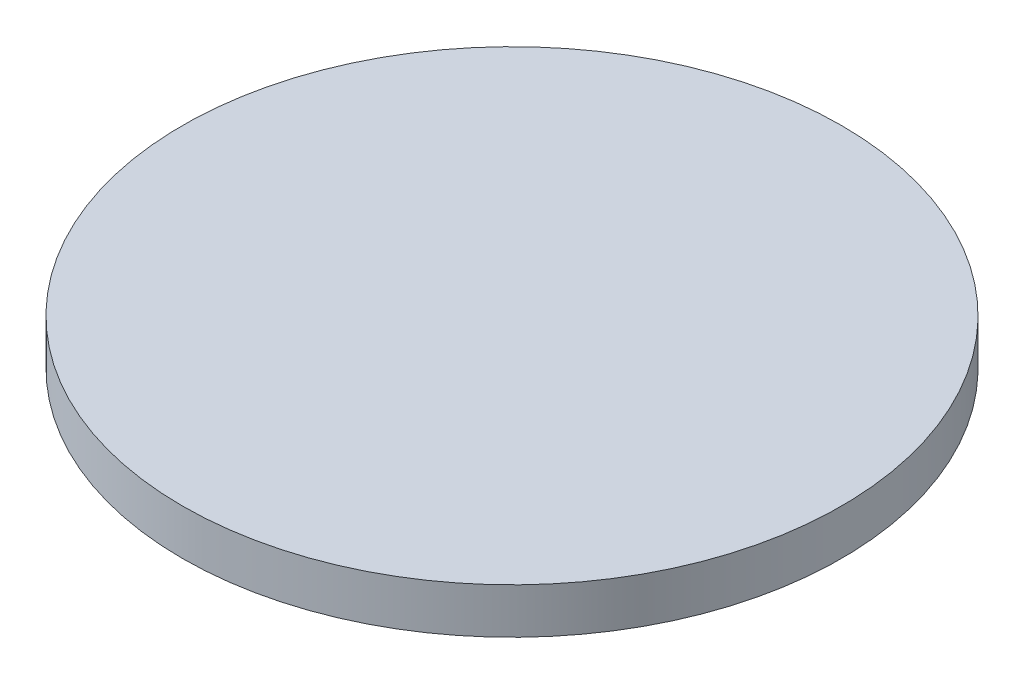
ISO-10303-21;
HEADER;
FILE_DESCRIPTION(('STEP AP214'),'2;1');
FILE_NAME('part.step','',(''),(''),'','','');
FILE_SCHEMA(('AUTOMOTIVE_DESIGN { 1 0 10303 214 1 1 1 1 }'));
ENDSEC;
DATA;
#1=APPLICATION_CONTEXT('core data for automotive mechanical design processes');
#2=APPLICATION_PROTOCOL_DEFINITION('international standard','automotive_design',2000,#1);
#3=PRODUCT_CONTEXT('',#1,'mechanical');
#4=PRODUCT('Part','Part','',(#3));
#5=PRODUCT_RELATED_PRODUCT_CATEGORY('part','',(#4));
#6=PRODUCT_DEFINITION_FORMATION('','',#4);
#7=PRODUCT_DEFINITION_CONTEXT('part definition',#1,'design');
#8=PRODUCT_DEFINITION('design','',#6,#7);
#9=PRODUCT_DEFINITION_SHAPE('','',#8);
#10=(LENGTH_UNIT() NAMED_UNIT(*) SI_UNIT(.MILLI.,.METRE.));
#11=(NAMED_UNIT(*) PLANE_ANGLE_UNIT() SI_UNIT($,.RADIAN.));
#12=(NAMED_UNIT(*) SI_UNIT($,.STERADIAN.) SOLID_ANGLE_UNIT());
#13=UNCERTAINTY_MEASURE_WITH_UNIT(LENGTH_MEASURE(1.E-05),#10,'distance_accuracy_value','');
#14=(GEOMETRIC_REPRESENTATION_CONTEXT(3) GLOBAL_UNCERTAINTY_ASSIGNED_CONTEXT((#13)) GLOBAL_UNIT_ASSIGNED_CONTEXT((#10,
#11,#12)) REPRESENTATION_CONTEXT('',''));
#15=CARTESIAN_POINT('',(0.,0.,0.));
#16=DIRECTION('',(0.,0.,1.));
#17=DIRECTION('',(1.,0.,0.));
#18=AXIS2_PLACEMENT_3D('',#15,#16,#17);
#19=CARTESIAN_POINT('',(0.,15.,0.));
#20=DIRECTION('',(0.,-1.,0.));
#21=DIRECTION('',(0.,0.,-1.));
#22=AXIS2_PLACEMENT_3D('',#19,#20,#21);
#23=CYLINDRICAL_SURFACE('',#22,217.5);
#24=CARTESIAN_POINT('',(0.,15.,0.));
#25=DIRECTION('',(0.,1.,0.));
#26=DIRECTION('',(0.,0.,1.));
#27=AXIS2_PLACEMENT_3D('',#24,#25,#26);
#28=CIRCLE('',#27,217.5);
#29=CARTESIAN_POINT('',(0.,15.,217.5));
#30=VERTEX_POINT('',#29);
#31=EDGE_CURVE('E10',#30,#30,#28,.T.);
#32=ORIENTED_EDGE('',*,*,#31,.F.);
#33=EDGE_LOOP('',(#32));
#34=FACE_BOUND('',#33,.T.);
#35=CARTESIAN_POINT('',(0.,-15.,0.));
#36=DIRECTION('',(0.,1.,0.));
#37=DIRECTION('',(0.,0.,1.));
#38=AXIS2_PLACEMENT_3D('',#35,#36,#37);
#39=CIRCLE('',#38,217.5);
#40=CARTESIAN_POINT('',(0.,-15.,217.5));
#41=VERTEX_POINT('',#40);
#42=EDGE_CURVE('E40',#41,#41,#39,.T.);
#43=ORIENTED_EDGE('',*,*,#42,.T.);
#44=EDGE_LOOP('',(#43));
#45=FACE_BOUND('',#44,.T.);
#46=ADVANCED_FACE('F37',(#34,#45),#23,.T.);
#47=CARTESIAN_POINT('',(0.,15.,0.));
#48=DIRECTION('',(0.,1.,0.));
#49=DIRECTION('',(0.,0.,1.));
#50=AXIS2_PLACEMENT_3D('',#47,#48,#49);
#51=PLANE('',#50);
#52=ORIENTED_EDGE('',*,*,#31,.T.);
#53=EDGE_LOOP('',(#52));
#54=FACE_BOUND('',#53,.T.);
#55=ADVANCED_FACE('F54',(#54),#51,.T.);
#56=CARTESIAN_POINT('',(0.,-15.,0.));
#57=DIRECTION('',(0.,1.,0.));
#58=DIRECTION('',(0.,0.,1.));
#59=AXIS2_PLACEMENT_3D('',#56,#57,#58);
#60=PLANE('',#59);
#61=ORIENTED_EDGE('',*,*,#42,.F.);
#62=EDGE_LOOP('',(#61));
#63=FACE_BOUND('',#62,.T.);
#64=ADVANCED_FACE('F52',(#63),#60,.F.);
#65=CLOSED_SHELL('',(#46,#55,#64));
#66=MANIFOLD_SOLID_BREP('B2',#65);
#67=ADVANCED_BREP_SHAPE_REPRESENTATION('',(#18,#66),#14);
#68=SHAPE_DEFINITION_REPRESENTATION(#9,#67);
ENDSEC;
END-ISO-10303-21;
